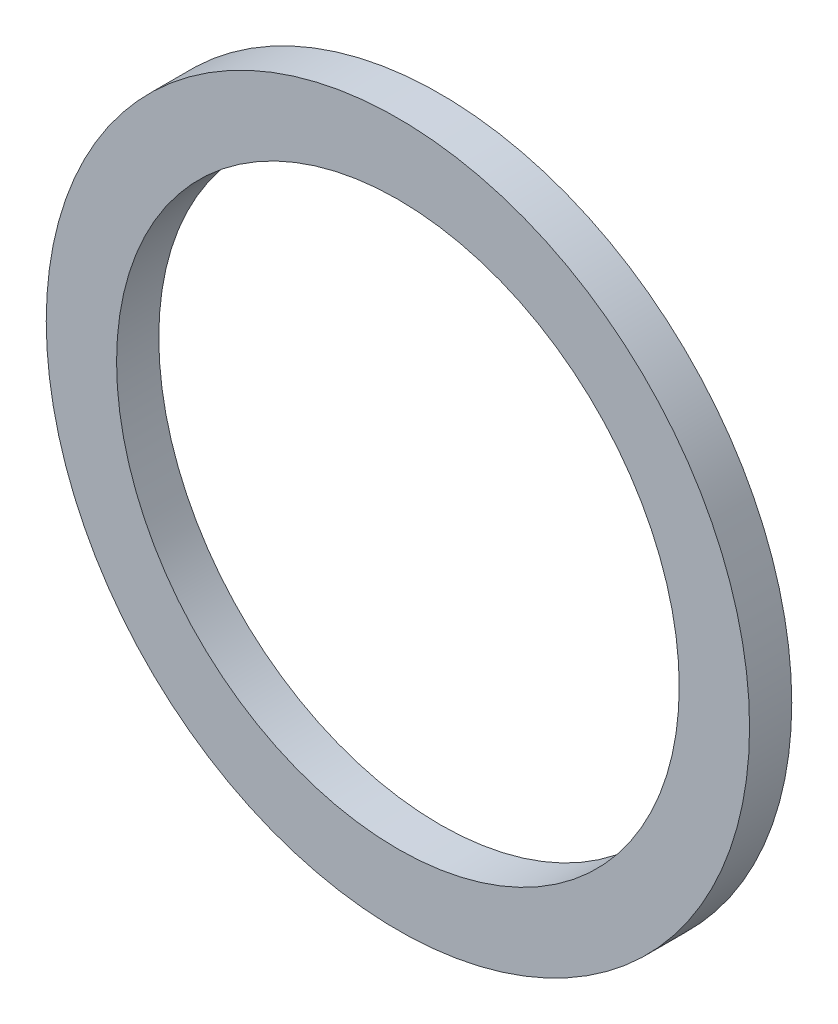
ISO-10303-21;
HEADER;
FILE_DESCRIPTION(('STEP AP214'),'2;1');
FILE_NAME('part.step','',(''),(''),'','','');
FILE_SCHEMA(('AUTOMOTIVE_DESIGN { 1 0 10303 214 1 1 1 1 }'));
ENDSEC;
DATA;
#1=APPLICATION_CONTEXT('core data for automotive mechanical design processes');
#2=APPLICATION_PROTOCOL_DEFINITION('international standard','automotive_design',2000,#1);
#3=PRODUCT_CONTEXT('',#1,'mechanical');
#4=PRODUCT('Part','Part','',(#3));
#5=PRODUCT_RELATED_PRODUCT_CATEGORY('part','',(#4));
#6=PRODUCT_DEFINITION_FORMATION('','',#4);
#7=PRODUCT_DEFINITION_CONTEXT('part definition',#1,'design');
#8=PRODUCT_DEFINITION('design','',#6,#7);
#9=PRODUCT_DEFINITION_SHAPE('','',#8);
#10=(LENGTH_UNIT() NAMED_UNIT(*) SI_UNIT(.MILLI.,.METRE.));
#11=(NAMED_UNIT(*) PLANE_ANGLE_UNIT() SI_UNIT($,.RADIAN.));
#12=(NAMED_UNIT(*) SI_UNIT($,.STERADIAN.) SOLID_ANGLE_UNIT());
#13=UNCERTAINTY_MEASURE_WITH_UNIT(LENGTH_MEASURE(1.E-05),#10,'distance_accuracy_value','');
#14=(GEOMETRIC_REPRESENTATION_CONTEXT(3) GLOBAL_UNCERTAINTY_ASSIGNED_CONTEXT((#13)) GLOBAL_UNIT_ASSIGNED_CONTEXT((#10,
#11,#12)) REPRESENTATION_CONTEXT('',''));
#15=CARTESIAN_POINT('',(0.,0.,0.));
#16=DIRECTION('',(0.,0.,1.));
#17=DIRECTION('',(1.,0.,0.));
#18=AXIS2_PLACEMENT_3D('',#15,#16,#17);
#19=CARTESIAN_POINT('',(0.,0.,0.));
#20=DIRECTION('',(0.,0.,1.));
#21=DIRECTION('',(1.,0.,0.));
#22=AXIS2_PLACEMENT_3D('',#19,#20,#21);
#23=PLANE('',#22);
#24=CARTESIAN_POINT('',(0.,0.,0.));
#25=DIRECTION('',(0.,0.,1.));
#26=DIRECTION('',(1.,0.,0.));
#27=AXIS2_PLACEMENT_3D('',#24,#25,#26);
#28=CIRCLE('',#27,25.);
#29=CARTESIAN_POINT('',(25.,0.,0.));
#30=VERTEX_POINT('',#29);
#31=EDGE_CURVE('E10',#30,#30,#28,.T.);
#32=ORIENTED_EDGE('',*,*,#31,.F.);
#33=EDGE_LOOP('',(#32));
#34=FACE_BOUND('',#33,.T.);
#35=CARTESIAN_POINT('',(0.,0.,0.));
#36=DIRECTION('',(0.,0.,1.));
#37=DIRECTION('',(1.,0.,0.));
#38=AXIS2_PLACEMENT_3D('',#35,#36,#37);
#39=CIRCLE('',#38,20.);
#40=CARTESIAN_POINT('',(20.,0.,0.));
#41=VERTEX_POINT('',#40);
#42=EDGE_CURVE('E46',#41,#41,#39,.T.);
#43=ORIENTED_EDGE('',*,*,#42,.T.);
#44=EDGE_LOOP('',(#43));
#45=FACE_BOUND('',#44,.T.);
#46=ADVANCED_FACE('F39',(#34,#45),#23,.F.);
#47=CARTESIAN_POINT('',(0.,0.,2.));
#48=DIRECTION('',(0.,0.,-1.));
#49=DIRECTION('',(-1.,0.,0.));
#50=AXIS2_PLACEMENT_3D('',#47,#48,#49);
#51=CYLINDRICAL_SURFACE('',#50,25.);
#52=ORIENTED_EDGE('',*,*,#31,.T.);
#53=EDGE_LOOP('',(#52));
#54=FACE_BOUND('',#53,.T.);
#55=CARTESIAN_POINT('',(0.,0.,3.));
#56=DIRECTION('',(0.,0.,1.));
#57=DIRECTION('',(1.,0.,0.));
#58=AXIS2_PLACEMENT_3D('',#55,#56,#57);
#59=CIRCLE('',#58,25.);
#60=CARTESIAN_POINT('',(25.,0.,3.));
#61=VERTEX_POINT('',#60);
#62=EDGE_CURVE('E50',#61,#61,#59,.T.);
#63=ORIENTED_EDGE('',*,*,#62,.F.);
#64=EDGE_LOOP('',(#63));
#65=FACE_BOUND('',#64,.T.);
#66=ADVANCED_FACE('F41',(#54,#65),#51,.T.);
#67=CARTESIAN_POINT('',(0.,0.,2.));
#68=DIRECTION('',(0.,0.,-1.));
#69=DIRECTION('',(-1.,0.,0.));
#70=AXIS2_PLACEMENT_3D('',#67,#68,#69);
#71=CYLINDRICAL_SURFACE('',#70,20.);
#72=ORIENTED_EDGE('',*,*,#42,.F.);
#73=EDGE_LOOP('',(#72));
#74=FACE_BOUND('',#73,.T.);
#75=CARTESIAN_POINT('',(0.,0.,3.));
#76=DIRECTION('',(0.,0.,-1.));
#77=DIRECTION('',(-1.,0.,0.));
#78=AXIS2_PLACEMENT_3D('',#75,#76,#77);
#79=CIRCLE('',#78,20.);
#80=CARTESIAN_POINT('',(-20.,0.,3.));
#81=VERTEX_POINT('',#80);
#82=EDGE_CURVE('E54',#81,#81,#79,.T.);
#83=ORIENTED_EDGE('',*,*,#82,.F.);
#84=EDGE_LOOP('',(#83));
#85=FACE_BOUND('',#84,.T.);
#86=ADVANCED_FACE('F63',(#74,#85),#71,.F.);
#87=CARTESIAN_POINT('',(0.,0.,3.));
#88=DIRECTION('',(0.,0.,1.));
#89=DIRECTION('',(1.,0.,0.));
#90=AXIS2_PLACEMENT_3D('',#87,#88,#89);
#91=PLANE('',#90);
#92=ORIENTED_EDGE('',*,*,#82,.T.);
#93=EDGE_LOOP('',(#92));
#94=FACE_BOUND('',#93,.T.);
#95=ORIENTED_EDGE('',*,*,#62,.T.);
#96=EDGE_LOOP('',(#95));
#97=FACE_BOUND('',#96,.T.);
#98=ADVANCED_FACE('F60',(#94,#97),#91,.T.);
#99=CLOSED_SHELL('',(#46,#66,#86,#98));
#100=MANIFOLD_SOLID_BREP('B2',#99);
#101=ADVANCED_BREP_SHAPE_REPRESENTATION('',(#18,#100),#14);
#102=SHAPE_DEFINITION_REPRESENTATION(#9,#101);
ENDSEC;
END-ISO-10303-21;
